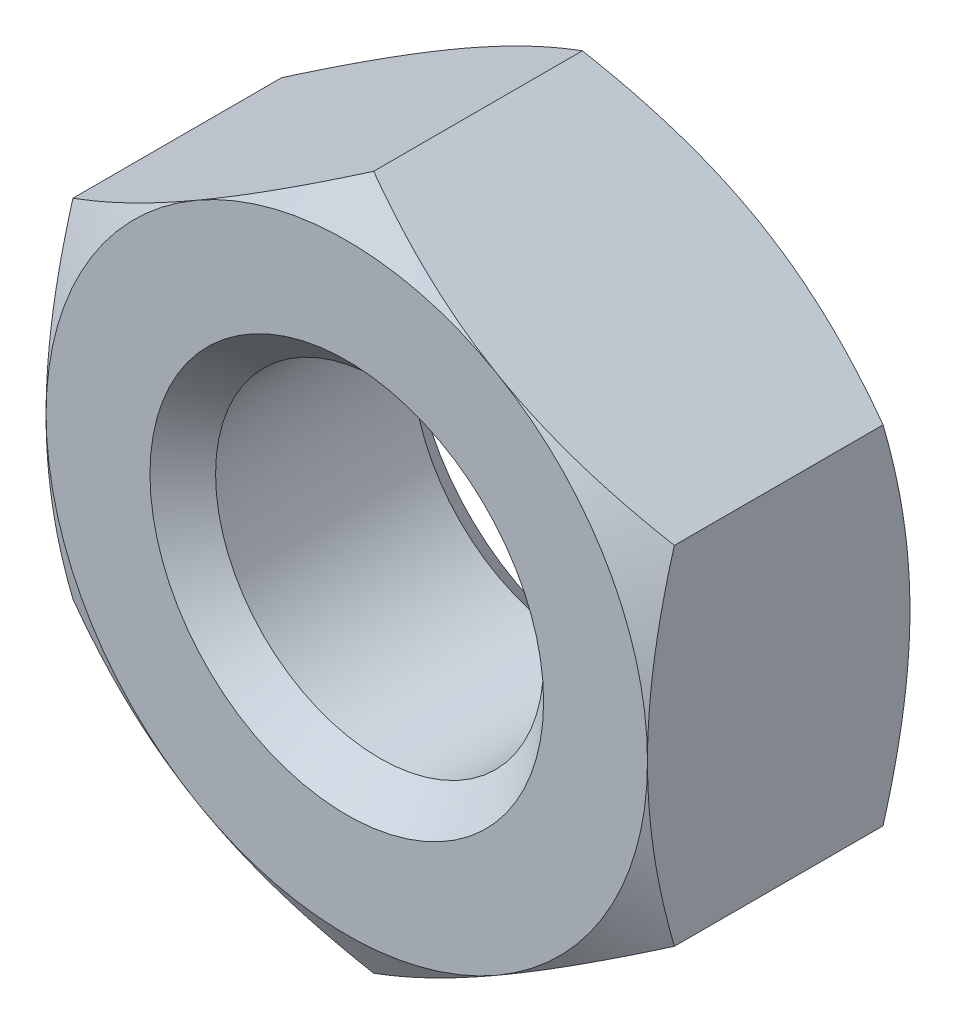
ISO-10303-21;
HEADER;
FILE_DESCRIPTION(('STEP AP214'),'2;1');
FILE_NAME('part.step','',(''),(''),'','','');
FILE_SCHEMA(('AUTOMOTIVE_DESIGN { 1 0 10303 214 1 1 1 1 }'));
ENDSEC;
DATA;
#1=APPLICATION_CONTEXT('core data for automotive mechanical design processes');
#2=APPLICATION_PROTOCOL_DEFINITION('international standard','automotive_design',2000,#1);
#3=PRODUCT_CONTEXT('',#1,'mechanical');
#4=PRODUCT('Part','Part','',(#3));
#5=PRODUCT_RELATED_PRODUCT_CATEGORY('part','',(#4));
#6=PRODUCT_DEFINITION_FORMATION('','',#4);
#7=PRODUCT_DEFINITION_CONTEXT('part definition',#1,'design');
#8=PRODUCT_DEFINITION('design','',#6,#7);
#9=PRODUCT_DEFINITION_SHAPE('','',#8);
#10=(LENGTH_UNIT() NAMED_UNIT(*) SI_UNIT(.MILLI.,.METRE.));
#11=(NAMED_UNIT(*) PLANE_ANGLE_UNIT() SI_UNIT($,.RADIAN.));
#12=(NAMED_UNIT(*) SI_UNIT($,.STERADIAN.) SOLID_ANGLE_UNIT());
#13=UNCERTAINTY_MEASURE_WITH_UNIT(LENGTH_MEASURE(1.E-05),#10,'distance_accuracy_value','');
#14=(GEOMETRIC_REPRESENTATION_CONTEXT(3) GLOBAL_UNCERTAINTY_ASSIGNED_CONTEXT((#13)) GLOBAL_UNIT_ASSIGNED_CONTEXT((#10,
#11,#12)) REPRESENTATION_CONTEXT('',''));
#15=CARTESIAN_POINT('',(0.,0.,0.));
#16=DIRECTION('',(0.,0.,1.));
#17=DIRECTION('',(1.,0.,0.));
#18=AXIS2_PLACEMENT_3D('',#15,#16,#17);
#19=CARTESIAN_POINT('',(0.,0.,2.4));
#20=DIRECTION('',(0.,0.,-1.));
#21=DIRECTION('',(-1.,0.,0.));
#22=AXIS2_PLACEMENT_3D('',#19,#20,#21);
#23=CONICAL_SURFACE('',#22,2.74999999999999,1.0471975511966);
#24=CARTESIAN_POINT('',(-0.000200000000000956,3.17554195059678,2.15431323663524));
#25=CARTESIAN_POINT('',(0.120649220659905,3.10576962051743,2.19461233775073));
#26=CARTESIAN_POINT('',(0.242541602622633,3.03539502097908,2.23126309740234));
#27=CARTESIAN_POINT('',(0.488437126727891,2.89342717394439,2.2952378170302));
#28=CARTESIAN_POINT('',(0.612444638573854,2.82183140359858,2.3225391443255));
#29=CARTESIAN_POINT('',(0.858922797975942,2.67952717191842,2.36503825470588));
#30=CARTESIAN_POINT('',(0.981355518587416,2.60884060771577,2.38051888137754));
#31=CARTESIAN_POINT('',(1.22679714236891,2.46713482015519,2.39900060263006));
#32=CARTESIAN_POINT('',(1.34980515323291,2.39611611197038,2.4020170005374));
#33=CARTESIAN_POINT('',(1.57965878661079,2.26341005486544,2.39574685457145));
#34=CARTESIAN_POINT('',(1.68653879125402,2.20170285541369,2.3879998457233));
#35=CARTESIAN_POINT('',(1.89960246733475,2.07869048467395,2.36344481893564));
#36=CARTESIAN_POINT('',(2.00578540164889,2.01738573896434,2.34662841034943));
#37=CARTESIAN_POINT('',(2.21928848939318,1.89411967378235,2.30458807765404));
#38=CARTESIAN_POINT('',(2.32658161614285,1.83217395817123,2.27918591931277));
#39=CARTESIAN_POINT('',(2.53956747928405,1.70920651275308,2.22153277416002));
#40=CARTESIAN_POINT('',(2.64526294502665,1.64818320715446,2.18929533670102));
#41=CARTESIAN_POINT('',(2.7502,1.58759777021764,2.15431323663524));
#42=B_SPLINE_CURVE_WITH_KNOTS('',3,(#24,#25,#26,#27,#28,#29,#30,#31,#32,#33,#34,#35,#36,#37,#38,
#39,#40,#41),.UNSPECIFIED.,.F.,.F.,(4,2,2,2,2,2,2,2,4),(0.,0.435912828725888,0.872873557116331,
1.29901931904671,1.72464171213573,2.09526089052937,2.46622354066374,2.84541551798557,
3.22386274754524),.UNSPECIFIED.);
#43=CARTESIAN_POINT('',(0.,3.17542648054294,2.15437990693814));
#44=VERTEX_POINT('',#43);
#45=CARTESIAN_POINT('',(1.375,2.38156986040721,2.4));
#46=VERTEX_POINT('',#45);
#47=EDGE_CURVE('E290',#44,#46,#42,.T.);
#48=ORIENTED_EDGE('',*,*,#47,.F.);
#49=CARTESIAN_POINT('',(-2.7502,1.58759777021763,2.15431323663524));
#50=CARTESIAN_POINT('',(-2.62935077934009,1.65737010029699,2.19461233775074));
#51=CARTESIAN_POINT('',(-2.50745839737737,1.72774469983533,2.23126309740234));
#52=CARTESIAN_POINT('',(-2.26156287327211,1.86971254687003,2.2952378170302));
#53=CARTESIAN_POINT('',(-2.13755536142614,1.94130831721583,2.3225391443255));
#54=CARTESIAN_POINT('',(-1.89107720202406,2.08361254889599,2.36503825470588));
#55=CARTESIAN_POINT('',(-1.76864448141258,2.15429911309864,2.38051888137754));
#56=CARTESIAN_POINT('',(-1.52320285763109,2.29600490065923,2.39900060263006));
#57=CARTESIAN_POINT('',(-1.40019484676709,2.36702360884404,2.4020170005374));
#58=CARTESIAN_POINT('',(-1.17034121338921,2.49972966594897,2.39574685457145));
#59=CARTESIAN_POINT('',(-1.06346120874598,2.56143686540073,2.3879998457233));
#60=CARTESIAN_POINT('',(-0.850397532665251,2.68444923614046,2.36344481893564));
#61=CARTESIAN_POINT('',(-0.744214598351111,2.74575398185008,2.34662841034943));
#62=CARTESIAN_POINT('',(-0.530711510606817,2.86902004703206,2.30458807765404));
#63=CARTESIAN_POINT('',(-0.423418383857146,2.93096576264318,2.27918591931277));
#64=CARTESIAN_POINT('',(-0.21043252071595,3.05393320806134,2.22153277416002));
#65=CARTESIAN_POINT('',(-0.104737054973348,3.11495651365995,2.18929533670102));
#66=CARTESIAN_POINT('',(0.000199999999998952,3.17554195059678,2.15431323663524));
#67=B_SPLINE_CURVE_WITH_KNOTS('',3,(#49,#50,#51,#52,#53,#54,#55,#56,#57,#58,#59,#60,#61,#62,#63,
#64,#65,#66),.UNSPECIFIED.,.F.,.F.,(4,2,2,2,2,2,2,2,4),(0.,0.435912828725888,0.872873557116331,
1.29901931904671,1.72464171213573,2.09526089052937,2.46622354066374,2.84541551798557,
3.22386274754524),.UNSPECIFIED.);
#68=CARTESIAN_POINT('',(-1.375,2.3815698604072,2.4));
#69=VERTEX_POINT('',#68);
#70=EDGE_CURVE('E185',#69,#44,#67,.T.);
#71=ORIENTED_EDGE('',*,*,#70,.F.);
#72=CARTESIAN_POINT('',(0.,0.,2.4));
#73=DIRECTION('',(0.,0.,1.));
#74=DIRECTION('',(1.,0.,0.));
#75=AXIS2_PLACEMENT_3D('',#72,#73,#74);
#76=CIRCLE('',#75,2.74999999999999);
#77=EDGE_CURVE('E293',#46,#69,#76,.T.);
#78=ORIENTED_EDGE('',*,*,#77,.F.);
#79=EDGE_LOOP('',(#48,#71,#78));
#80=FACE_BOUND('',#79,.T.);
#81=ADVANCED_FACE('F34',(#80),#23,.T.);
#82=CARTESIAN_POINT('',(2.75,1.58771324027147,2.15437990693814));
#83=VERTEX_POINT('',#82);
#84=EDGE_CURVE('E228',#46,#83,#42,.T.);
#85=ORIENTED_EDGE('',*,*,#84,.F.);
#86=CARTESIAN_POINT('',(2.75,0.,2.4));
#87=VERTEX_POINT('',#86);
#88=EDGE_CURVE('E150',#87,#46,#76,.T.);
#89=ORIENTED_EDGE('',*,*,#88,.F.);
#90=CARTESIAN_POINT('',(2.75,-4.2168242339339,1.08116278656109));
#91=CARTESIAN_POINT('',(2.75,-4.09603703531195,1.13955861611692));
#92=CARTESIAN_POINT('',(2.75,-3.97496493145791,1.19737577109415));
#93=CARTESIAN_POINT('',(2.75,-3.73209689574417,1.31152219563668));
#94=CARTESIAN_POINT('',(2.75,-3.61030084360811,1.36785120899004));
#95=CARTESIAN_POINT('',(2.75,-3.36517590540257,1.47898625620549));
#96=CARTESIAN_POINT('',(2.75,-3.24184223980786,1.5337817860504));
#97=CARTESIAN_POINT('',(2.75,-2.99416342051523,1.64102783845281));
#98=CARTESIAN_POINT('',(2.75,-2.86981831972063,1.69347848273961));
#99=CARTESIAN_POINT('',(2.75,-2.61834746028677,1.79604554979606));
#100=CARTESIAN_POINT('',(2.75,-2.49120637273191,1.84612459510075));
#101=CARTESIAN_POINT('',(2.75,-2.23542668575144,1.94237540457807));
#102=CARTESIAN_POINT('',(2.75,-2.10678792179923,1.98854673477406));
#103=CARTESIAN_POINT('',(2.75,-1.8480704466003,2.07574586666894));
#104=CARTESIAN_POINT('',(2.75,-1.71799544128962,2.11678455175498));
#105=CARTESIAN_POINT('',(2.75,-1.45599596679683,2.19238946193699));
#106=CARTESIAN_POINT('',(2.75,-1.32407209489248,2.22695772775981));
#107=CARTESIAN_POINT('',(2.75,-1.05828725071346,2.28794682395108));
#108=CARTESIAN_POINT('',(2.75,-0.924425845513397,2.31436580306384));
#109=CARTESIAN_POINT('',(2.75,-0.655082446819992,2.35728271685336));
#110=CARTESIAN_POINT('',(2.75,-0.519600452944037,2.37378064918776));
#111=CARTESIAN_POINT('',(2.75,-0.248587158257116,2.39539614360341));
#112=CARTESIAN_POINT('',(2.75,-0.11306180437275,2.400586376139));
#113=CARTESIAN_POINT('',(2.75,0.157903901119134,2.39930808557646));
#114=CARTESIAN_POINT('',(2.75,0.293344265697949,2.39284261980861));
#115=CARTESIAN_POINT('',(2.75,0.524440714708305,2.37232216214596));
#116=CARTESIAN_POINT('',(2.75,0.62035131964063,2.36098014392554));
#117=CARTESIAN_POINT('',(2.75,0.81143566214081,2.33318570677033));
#118=CARTESIAN_POINT('',(2.75,0.906609281825054,2.31673248690527));
#119=CARTESIAN_POINT('',(2.75,1.19094492996529,2.26056903357191));
#120=CARTESIAN_POINT('',(2.75,1.37877883239588,2.21406933314649));
#121=CARTESIAN_POINT('',(2.75,1.65985527821032,2.13381925193692));
#122=CARTESIAN_POINT('',(2.75,1.75456166739172,2.10490803332331));
#123=CARTESIAN_POINT('',(2.75,1.94298612436378,2.04421214901231));
#124=CARTESIAN_POINT('',(2.75,2.03670482331285,2.0124294604322));
#125=CARTESIAN_POINT('',(2.75,2.22276207977635,1.94665298493381));
#126=CARTESIAN_POINT('',(2.75,2.31510543361457,1.91267262805081));
#127=CARTESIAN_POINT('',(2.75,2.49907460103441,1.84270924628523));
#128=CARTESIAN_POINT('',(2.75,2.59070010932415,1.80672541703888));
#129=CARTESIAN_POINT('',(2.75,2.68199376510632,1.76993728554647));
#130=B_SPLINE_CURVE_WITH_KNOTS('',3,(#90,#91,#92,#93,#94,#95,#96,#97,#98,#99,#100,#101,#102,
#103,#104,#105,#106,#107,#108,#109,#110,#111,#112,#113,#114,#115,#116,#117,#118,#119,#120,#121,
#122,#123,#124,#125,#126,#127,#128,#129),.UNSPECIFIED.,.F.,.F.,(4,2,2,2,2,2,2,2,2,2,2,2,2,2,2,2,
2,2,2,4),(0.,0.402493360368358,0.805055571903377,1.20991106865585,1.61474552380934,
2.02464088525632,2.43458170862463,2.84363798989705,3.25256503936949,3.66158491561185,
4.07060488842396,4.47698838837614,4.88326530802959,5.17286074262768,5.46250158002234,
6.04221220969898,6.33925145814178,6.63608772005808,6.93125578235463,7.22654321688608),.UNSPECIFIED.);
#131=EDGE_CURVE('E226',#83,#87,#130,.F.);
#132=ORIENTED_EDGE('',*,*,#131,.F.);
#133=EDGE_LOOP('',(#85,#89,#132));
#134=FACE_BOUND('',#133,.T.);
#135=ADVANCED_FACE('F281',(#134),#23,.T.);
#136=CARTESIAN_POINT('',(2.75,-1.58771324027147,2.15437990693814));
#137=VERTEX_POINT('',#136);
#138=EDGE_CURVE('E221',#87,#137,#130,.F.);
#139=ORIENTED_EDGE('',*,*,#138,.F.);
#140=CARTESIAN_POINT('',(1.375,-2.38156986040721,2.4));
#141=VERTEX_POINT('',#140);
#142=EDGE_CURVE('E296',#141,#87,#76,.T.);
#143=ORIENTED_EDGE('',*,*,#142,.F.);
#144=CARTESIAN_POINT('',(2.7502,-1.58759777021763,2.15431323663524));
#145=CARTESIAN_POINT('',(2.62935077934009,-1.65737010029699,2.19461233775074));
#146=CARTESIAN_POINT('',(2.50745839737736,-1.72774469983533,2.23126309740234));
#147=CARTESIAN_POINT('',(2.26156287327211,-1.86971254687003,2.2952378170302));
#148=CARTESIAN_POINT('',(2.13755536142614,-1.94130831721583,2.3225391443255));
#149=CARTESIAN_POINT('',(1.89107720202405,-2.08361254889599,2.36503825470588));
#150=CARTESIAN_POINT('',(1.76864448141258,-2.15429911309864,2.38051888137754));
#151=CARTESIAN_POINT('',(1.52320285763108,-2.29600490065923,2.39900060263006));
#152=CARTESIAN_POINT('',(1.40019484676709,-2.36702360884404,2.4020170005374));
#153=CARTESIAN_POINT('',(1.17034121338921,-2.49972966594897,2.39574685457145));
#154=CARTESIAN_POINT('',(1.06346120874598,-2.56143686540072,2.3879998457233));
#155=CARTESIAN_POINT('',(0.85039753266525,-2.68444923614046,2.36344481893564));
#156=CARTESIAN_POINT('',(0.74421459835111,-2.74575398185008,2.34662841034943));
#157=CARTESIAN_POINT('',(0.530711510606816,-2.86902004703206,2.30458807765404));
#158=CARTESIAN_POINT('',(0.423418383857145,-2.93096576264318,2.27918591931277));
#159=CARTESIAN_POINT('',(0.210432520715949,-3.05393320806134,2.22153277416002));
#160=CARTESIAN_POINT('',(0.104737054973348,-3.11495651365995,2.18929533670102));
#161=CARTESIAN_POINT('',(-0.000199999999999843,-3.17554195059678,2.15431323663524));
#162=B_SPLINE_CURVE_WITH_KNOTS('',3,(#144,#145,#146,#147,#148,#149,#150,#151,#152,#153,#154,
#155,#156,#157,#158,#159,#160,#161),.UNSPECIFIED.,.F.,.F.,(4,2,2,2,2,2,2,2,4),(0.,
0.435912828725887,0.87287355711633,1.29901931904671,1.72464171213573,2.09526089052937,
2.46622354066374,2.84541551798557,3.22386274754524),.UNSPECIFIED.);
#163=EDGE_CURVE('E227',#137,#141,#162,.T.);
#164=ORIENTED_EDGE('',*,*,#163,.F.);
#165=EDGE_LOOP('',(#139,#143,#164));
#166=FACE_BOUND('',#165,.T.);
#167=ADVANCED_FACE('F286',(#166),#23,.T.);
#168=CARTESIAN_POINT('',(0.,-3.17542648054294,2.15437990693814));
#169=VERTEX_POINT('',#168);
#170=EDGE_CURVE('E215',#141,#169,#162,.T.);
#171=ORIENTED_EDGE('',*,*,#170,.F.);
#172=CARTESIAN_POINT('',(-1.375,-2.38156986040721,2.4));
#173=VERTEX_POINT('',#172);
#174=EDGE_CURVE('E298',#173,#141,#76,.T.);
#175=ORIENTED_EDGE('',*,*,#174,.F.);
#176=CARTESIAN_POINT('',(0.000199999999999783,-3.17554195059678,2.15431323663524));
#177=CARTESIAN_POINT('',(-0.120649220659906,-3.10576962051742,2.19461233775074));
#178=CARTESIAN_POINT('',(-0.242541602622634,-3.03539502097908,2.23126309740234));
#179=CARTESIAN_POINT('',(-0.488437126727892,-2.89342717394438,2.2952378170302));
#180=CARTESIAN_POINT('',(-0.612444638573855,-2.82183140359858,2.3225391443255));
#181=CARTESIAN_POINT('',(-0.858922797975943,-2.67952717191842,2.36503825470588));
#182=CARTESIAN_POINT('',(-0.981355518587416,-2.60884060771577,2.38051888137754));
#183=CARTESIAN_POINT('',(-1.22679714236891,-2.46713482015518,2.39900060263006));
#184=CARTESIAN_POINT('',(-1.34980515323291,-2.39611611197037,2.4020170005374));
#185=CARTESIAN_POINT('',(-1.57965878661079,-2.26341005486544,2.39574685457145));
#186=CARTESIAN_POINT('',(-1.68653879125402,-2.20170285541369,2.3879998457233));
#187=CARTESIAN_POINT('',(-1.89960246733475,-2.07869048467395,2.36344481893564));
#188=CARTESIAN_POINT('',(-2.00578540164889,-2.01738573896433,2.34662841034943));
#189=CARTESIAN_POINT('',(-2.21928848939318,-1.89411967378235,2.30458807765404));
#190=CARTESIAN_POINT('',(-2.32658161614285,-1.83217395817123,2.27918591931277));
#191=CARTESIAN_POINT('',(-2.53956747928405,-1.70920651275307,2.22153277416002));
#192=CARTESIAN_POINT('',(-2.64526294502665,-1.64818320715446,2.18929533670102));
#193=CARTESIAN_POINT('',(-2.7502,-1.58759777021763,2.15431323663524));
#194=B_SPLINE_CURVE_WITH_KNOTS('',3,(#176,#177,#178,#179,#180,#181,#182,#183,#184,#185,#186,
#187,#188,#189,#190,#191,#192,#193),.UNSPECIFIED.,.F.,.F.,(4,2,2,2,2,2,2,2,4),(0.,
0.435912828725888,0.872873557116331,1.29901931904671,1.72464171213573,2.09526089052937,
2.46622354066374,2.84541551798557,3.22386274754524),.UNSPECIFIED.);
#195=EDGE_CURVE('E322',#169,#173,#194,.T.);
#196=ORIENTED_EDGE('',*,*,#195,.F.);
#197=EDGE_LOOP('',(#171,#175,#196));
#198=FACE_BOUND('',#197,.T.);
#199=ADVANCED_FACE('F326',(#198),#23,.T.);
#200=CARTESIAN_POINT('',(-2.75,-1.58771324027147,2.15437990693814));
#201=VERTEX_POINT('',#200);
#202=EDGE_CURVE('E210',#173,#201,#194,.T.);
#203=ORIENTED_EDGE('',*,*,#202,.F.);
#204=CARTESIAN_POINT('',(-2.75,0.,2.4));
#205=VERTEX_POINT('',#204);
#206=EDGE_CURVE('E313',#205,#173,#76,.T.);
#207=ORIENTED_EDGE('',*,*,#206,.F.);
#208=CARTESIAN_POINT('',(-2.75,-4.2168242339339,1.08116278656109));
#209=CARTESIAN_POINT('',(-2.75,-4.09603703531196,1.13955861611692));
#210=CARTESIAN_POINT('',(-2.75,-3.97496493145791,1.19737577109415));
#211=CARTESIAN_POINT('',(-2.75,-3.73209689574417,1.31152219563668));
#212=CARTESIAN_POINT('',(-2.75,-3.61030084360811,1.36785120899004));
#213=CARTESIAN_POINT('',(-2.75,-3.36517590540258,1.47898625620549));
#214=CARTESIAN_POINT('',(-2.75,-3.24184223980786,1.5337817860504));
#215=CARTESIAN_POINT('',(-2.75,-2.99416342051523,1.6410278384528));
#216=CARTESIAN_POINT('',(-2.75,-2.86981831972063,1.69347848273961));
#217=CARTESIAN_POINT('',(-2.75,-2.61834746028677,1.79604554979606));
#218=CARTESIAN_POINT('',(-2.75,-2.49120637273191,1.84612459510074));
#219=CARTESIAN_POINT('',(-2.75,-2.23542668575144,1.94237540457807));
#220=CARTESIAN_POINT('',(-2.75,-2.10678792179922,1.98854673477406));
#221=CARTESIAN_POINT('',(-2.75,-1.8480704466003,2.07574586666894));
#222=CARTESIAN_POINT('',(-2.75,-1.71799544128962,2.11678455175498));
#223=CARTESIAN_POINT('',(-2.75,-1.45599596679683,2.19238946193699));
#224=CARTESIAN_POINT('',(-2.75,-1.32407209489248,2.2269577277598));
#225=CARTESIAN_POINT('',(-2.75,-1.05828725071346,2.28794682395108));
#226=CARTESIAN_POINT('',(-2.75,-0.924425845513396,2.31436580306384));
#227=CARTESIAN_POINT('',(-2.75,-0.655082446819991,2.35728271685336));
#228=CARTESIAN_POINT('',(-2.75,-0.519600452944036,2.37378064918776));
#229=CARTESIAN_POINT('',(-2.75,-0.248587158257115,2.39539614360341));
#230=CARTESIAN_POINT('',(-2.75,-0.113061804372749,2.400586376139));
#231=CARTESIAN_POINT('',(-2.75,0.157903901119135,2.39930808557646));
#232=CARTESIAN_POINT('',(-2.75,0.29334426569795,2.39284261980861));
#233=CARTESIAN_POINT('',(-2.75,0.524440714708306,2.37232216214595));
#234=CARTESIAN_POINT('',(-2.75,0.620351319640631,2.36098014392554));
#235=CARTESIAN_POINT('',(-2.75,0.81143566214081,2.33318570677033));
#236=CARTESIAN_POINT('',(-2.75,0.906609281825056,2.31673248690526));
#237=CARTESIAN_POINT('',(-2.75,1.19094492996529,2.26056903357191));
#238=CARTESIAN_POINT('',(-2.75,1.37877883239589,2.21406933314649));
#239=CARTESIAN_POINT('',(-2.75,1.65985527821033,2.13381925193691));
#240=CARTESIAN_POINT('',(-2.75,1.75456166739172,2.10490803332331));
#241=CARTESIAN_POINT('',(-2.75,1.94298612436379,2.04421214901231));
#242=CARTESIAN_POINT('',(-2.75,2.03670482331285,2.0124294604322));
#243=CARTESIAN_POINT('',(-2.75,2.22276207977636,1.94665298493381));
#244=CARTESIAN_POINT('',(-2.75,2.31510543361457,1.9126726280508));
#245=CARTESIAN_POINT('',(-2.75,2.49907460103441,1.84270924628522));
#246=CARTESIAN_POINT('',(-2.75,2.59070010932416,1.80672541703888));
#247=CARTESIAN_POINT('',(-2.75,2.68199376510633,1.76993728554647));
#248=B_SPLINE_CURVE_WITH_KNOTS('',3,(#208,#209,#210,#211,#212,#213,#214,#215,#216,#217,#218,
#219,#220,#221,#222,#223,#224,#225,#226,#227,#228,#229,#230,#231,#232,#233,#234,#235,#236,#237,
#238,#239,#240,#241,#242,#243,#244,#245,#246,#247),.UNSPECIFIED.,.F.,.F.,(4,2,2,2,2,2,2,2,2,2,2,
2,2,2,2,2,2,2,2,4),(0.,0.402493360368358,0.805055571903377,1.20991106865585,1.61474552380935,
2.02464088525632,2.43458170862463,2.84363798989705,3.2525650393695,3.66158491561185,
4.07060488842396,4.47698838837614,4.88326530802959,5.17286074262768,5.46250158002235,
6.04221220969899,6.33925145814179,6.63608772005809,6.93125578235464,7.22654321688608),.UNSPECIFIED.);
#249=EDGE_CURVE('E318',#201,#205,#248,.T.);
#250=ORIENTED_EDGE('',*,*,#249,.F.);
#251=EDGE_LOOP('',(#203,#207,#250));
#252=FACE_BOUND('',#251,.T.);
#253=ADVANCED_FACE('F202',(#252),#23,.T.);
#254=CARTESIAN_POINT('',(0.,0.,0.288675134594814));
#255=DIRECTION('',(0.,0.,1.));
#256=DIRECTION('',(1.,0.,0.));
#257=AXIS2_PLACEMENT_3D('',#254,#255,#256);
#258=CONICAL_SURFACE('',#257,3.25,1.0471975511966);
#259=CARTESIAN_POINT('',(-0.000200000000000217,-3.17554195059678,0.245686763364761));
#260=CARTESIAN_POINT('',(0.120649220659906,-3.10576962051742,0.205387662249264));
#261=CARTESIAN_POINT('',(0.242541602622634,-3.03539502097908,0.168736902597663));
#262=CARTESIAN_POINT('',(0.488437126727892,-2.89342717394438,0.104762182969802));
#263=CARTESIAN_POINT('',(0.612444638573855,-2.82183140359858,0.0774608556744986));
#264=CARTESIAN_POINT('',(0.858922797975943,-2.67952717191842,0.0349617452941183));
#265=CARTESIAN_POINT('',(0.981355518587416,-2.60884060771577,0.0194811186224594));
#266=CARTESIAN_POINT('',(1.22679714236891,-2.46713482015518,0.00099939736994213));
#267=CARTESIAN_POINT('',(1.34980515323291,-2.39611611197037,-0.00201700053739867));
#268=CARTESIAN_POINT('',(1.57965878661079,-2.26341005486544,0.00425314542854825));
#269=CARTESIAN_POINT('',(1.68653879125402,-2.20170285541369,0.0120001542767039));
#270=CARTESIAN_POINT('',(1.89960246733475,-2.07869048467395,0.0365551810643561));
#271=CARTESIAN_POINT('',(2.00578540164889,-2.01738573896433,0.0533715896505716));
#272=CARTESIAN_POINT('',(2.21928848939318,-1.89411967378235,0.0954119223459572));
#273=CARTESIAN_POINT('',(2.32658161614285,-1.83217395817123,0.120814080687231));
#274=CARTESIAN_POINT('',(2.53956747928405,-1.70920651275308,0.178467225839982));
#275=CARTESIAN_POINT('',(2.64526294502665,-1.64818320715446,0.210704663298982));
#276=CARTESIAN_POINT('',(2.7502,-1.58759777021763,0.24568676336476));
#277=B_SPLINE_CURVE_WITH_KNOTS('',3,(#259,#260,#261,#262,#263,#264,#265,#266,#267,#268,#269,
#270,#271,#272,#273,#274,#275,#276),.UNSPECIFIED.,.F.,.F.,(4,2,2,2,2,2,2,2,4),(0.,
0.435912828725888,0.872873557116331,1.29901931904671,1.72464171213573,2.09526089052937,
2.46622354066374,2.84541551798557,3.22386274754524),.UNSPECIFIED.);
#278=CARTESIAN_POINT('',(0.,-3.17542648054294,0.245620093061863));
#279=VERTEX_POINT('',#278);
#280=CARTESIAN_POINT('',(1.375,-2.38156986040721,0.));
#281=VERTEX_POINT('',#280);
#282=EDGE_CURVE('E258',#279,#281,#277,.T.);
#283=ORIENTED_EDGE('',*,*,#282,.F.);
#284=CARTESIAN_POINT('',(-2.7502,-1.58759777021763,0.245686763364761));
#285=CARTESIAN_POINT('',(-2.62935077934009,-1.65737010029699,0.205387662249264));
#286=CARTESIAN_POINT('',(-2.50745839737737,-1.72774469983533,0.168736902597663));
#287=CARTESIAN_POINT('',(-2.26156287327211,-1.86971254687003,0.104762182969802));
#288=CARTESIAN_POINT('',(-2.13755536142614,-1.94130831721583,0.0774608556744991));
#289=CARTESIAN_POINT('',(-1.89107720202406,-2.08361254889599,0.0349617452941187));
#290=CARTESIAN_POINT('',(-1.76864448141258,-2.15429911309864,0.0194811186224596));
#291=CARTESIAN_POINT('',(-1.52320285763108,-2.29600490065923,0.000999397369942366));
#292=CARTESIAN_POINT('',(-1.40019484676709,-2.36702360884404,-0.00201700053739826));
#293=CARTESIAN_POINT('',(-1.17034121338921,-2.49972966594897,0.00425314542854864));
#294=CARTESIAN_POINT('',(-1.06346120874598,-2.56143686540072,0.0120001542767042));
#295=CARTESIAN_POINT('',(-0.85039753266525,-2.68444923614046,0.0365551810643563));
#296=CARTESIAN_POINT('',(-0.744214598351111,-2.74575398185008,0.0533715896505717));
#297=CARTESIAN_POINT('',(-0.530711510606817,-2.86902004703206,0.0954119223459575));
#298=CARTESIAN_POINT('',(-0.423418383857145,-2.93096576264318,0.120814080687232));
#299=CARTESIAN_POINT('',(-0.210432520715949,-3.05393320806134,0.178467225839983));
#300=CARTESIAN_POINT('',(-0.104737054973348,-3.11495651365995,0.210704663298983));
#301=CARTESIAN_POINT('',(0.000199999999999287,-3.17554195059678,0.24568676336476));
#302=B_SPLINE_CURVE_WITH_KNOTS('',3,(#284,#285,#286,#287,#288,#289,#290,#291,#292,#293,#294,
#295,#296,#297,#298,#299,#300,#301),.UNSPECIFIED.,.F.,.F.,(4,2,2,2,2,2,2,2,4),(0.,
0.435912828725888,0.872873557116331,1.29901931904671,1.72464171213573,2.09526089052937,
2.46622354066374,2.84541551798557,3.22386274754524),.UNSPECIFIED.);
#303=CARTESIAN_POINT('',(-1.375,-2.38156986040721,0.));
#304=VERTEX_POINT('',#303);
#305=EDGE_CURVE('E259',#304,#279,#302,.T.);
#306=ORIENTED_EDGE('',*,*,#305,.F.);
#307=CARTESIAN_POINT('',(0.,0.,0.));
#308=DIRECTION('',(0.,0.,1.));
#309=DIRECTION('',(1.,0.,0.));
#310=AXIS2_PLACEMENT_3D('',#307,#308,#309);
#311=CIRCLE('',#310,2.74999999999999);
#312=EDGE_CURVE('E161',#281,#304,#311,.F.);
#313=ORIENTED_EDGE('',*,*,#312,.F.);
#314=EDGE_LOOP('',(#283,#306,#313));
#315=FACE_BOUND('',#314,.T.);
#316=ADVANCED_FACE('F357',(#315),#258,.T.);
#317=CARTESIAN_POINT('',(2.75,-1.58771324027147,0.245620093061862));
#318=VERTEX_POINT('',#317);
#319=EDGE_CURVE('E253',#281,#318,#277,.T.);
#320=ORIENTED_EDGE('',*,*,#319,.F.);
#321=CARTESIAN_POINT('',(2.75,0.,0.));
#322=VERTEX_POINT('',#321);
#323=EDGE_CURVE('E152',#322,#281,#311,.F.);
#324=ORIENTED_EDGE('',*,*,#323,.F.);
#325=CARTESIAN_POINT('',(2.75,-4.2168242339339,1.31883721343891));
#326=CARTESIAN_POINT('',(2.75,-4.09603703531195,1.26044138388308));
#327=CARTESIAN_POINT('',(2.75,-3.97496493145791,1.20262422890585));
#328=CARTESIAN_POINT('',(2.75,-3.73209689574417,1.08847780436332));
#329=CARTESIAN_POINT('',(2.75,-3.61030084360811,1.03214879100996));
#330=CARTESIAN_POINT('',(2.75,-3.36517590540257,0.921013743794508));
#331=CARTESIAN_POINT('',(2.75,-3.24184223980786,0.8662182139496));
#332=CARTESIAN_POINT('',(2.75,-2.99416342051523,0.758972161547195));
#333=CARTESIAN_POINT('',(2.75,-2.86981831972063,0.706521517260392));
#334=CARTESIAN_POINT('',(2.75,-2.61834746028677,0.60395445020394));
#335=CARTESIAN_POINT('',(2.75,-2.49120637273191,0.553875404899256));
#336=CARTESIAN_POINT('',(2.75,-2.23542668575144,0.45762459542193));
#337=CARTESIAN_POINT('',(2.75,-2.10678792179923,0.411453265225941));
#338=CARTESIAN_POINT('',(2.75,-1.8480704466003,0.324254133331062));
#339=CARTESIAN_POINT('',(2.75,-1.71799544128962,0.283215448245023));
#340=CARTESIAN_POINT('',(2.75,-1.45599596679683,0.207610538063014));
#341=CARTESIAN_POINT('',(2.75,-1.32407209489248,0.173042272240195));
#342=CARTESIAN_POINT('',(2.75,-1.05828725071346,0.11205317604892));
#343=CARTESIAN_POINT('',(2.75,-0.924425845513397,0.0856341969361633));
#344=CARTESIAN_POINT('',(2.75,-0.655082446819991,0.0427172831466394));
#345=CARTESIAN_POINT('',(2.75,-0.519600452944037,0.0262193508122365));
#346=CARTESIAN_POINT('',(2.75,-0.248587158257116,0.0046038563965916));
#347=CARTESIAN_POINT('',(2.75,-0.11306180437275,-0.000586376139000701));
#348=CARTESIAN_POINT('',(2.75,0.157903901119135,0.000691914423535405));
#349=CARTESIAN_POINT('',(2.75,0.293344265697949,0.00715738019138507));
#350=CARTESIAN_POINT('',(2.75,0.524440714708305,0.027677837854044));
#351=CARTESIAN_POINT('',(2.75,0.62035131964063,0.0390198560744575));
#352=CARTESIAN_POINT('',(2.75,0.811435662140809,0.0668142932296693));
#353=CARTESIAN_POINT('',(2.75,0.906609281825054,0.0832675130947343));
#354=CARTESIAN_POINT('',(2.75,1.19094492996529,0.139430966428091));
#355=CARTESIAN_POINT('',(2.75,1.37877883239588,0.185930666853508));
#356=CARTESIAN_POINT('',(2.75,1.65985527821032,0.266180748063083));
#357=CARTESIAN_POINT('',(2.75,1.75456166739171,0.295091966676684));
#358=CARTESIAN_POINT('',(2.75,1.94298612436378,0.35578785098769));
#359=CARTESIAN_POINT('',(2.75,2.03670482331285,0.387570539567797));
#360=CARTESIAN_POINT('',(2.75,2.22276207977635,0.453347015066185));
#361=CARTESIAN_POINT('',(2.75,2.31510543361457,0.487327371949193));
#362=CARTESIAN_POINT('',(2.75,2.49907460103441,0.557290753714772));
#363=CARTESIAN_POINT('',(2.75,2.59070010932415,0.593274582961117));
#364=CARTESIAN_POINT('',(2.75,2.68199376510632,0.630062714453528));
#365=B_SPLINE_CURVE_WITH_KNOTS('',3,(#325,#326,#327,#328,#329,#330,#331,#332,#333,#334,#335,
#336,#337,#338,#339,#340,#341,#342,#343,#344,#345,#346,#347,#348,#349,#350,#351,#352,#353,#354,
#355,#356,#357,#358,#359,#360,#361,#362,#363,#364),.UNSPECIFIED.,.F.,.F.,(4,2,2,2,2,2,2,2,2,2,2,
2,2,2,2,2,2,2,2,4),(0.,0.402493360368357,0.805055571903377,1.20991106865585,1.61474552380934,
2.02464088525632,2.43458170862463,2.84363798989705,3.25256503936949,3.66158491561185,
4.07060488842396,4.47698838837614,4.88326530802959,5.17286074262768,5.46250158002234,
6.04221220969898,6.33925145814178,6.63608772005808,6.93125578235463,7.22654321688607),.UNSPECIFIED.);
#366=EDGE_CURVE('E248',#318,#322,#365,.T.);
#367=ORIENTED_EDGE('',*,*,#366,.F.);
#368=EDGE_LOOP('',(#320,#324,#367));
#369=FACE_BOUND('',#368,.T.);
#370=ADVANCED_FACE('F352',(#369),#258,.T.);
#371=CARTESIAN_POINT('',(2.75,1.58771324027147,0.245620093061863));
#372=VERTEX_POINT('',#371);
#373=EDGE_CURVE('E146',#322,#372,#365,.T.);
#374=ORIENTED_EDGE('',*,*,#373,.F.);
#375=CARTESIAN_POINT('',(1.375,2.38156986040721,0.));
#376=VERTEX_POINT('',#375);
#377=EDGE_CURVE('E144',#376,#322,#311,.F.);
#378=ORIENTED_EDGE('',*,*,#377,.F.);
#379=CARTESIAN_POINT('',(2.7502,1.58759777021764,0.245686763364761));
#380=CARTESIAN_POINT('',(2.62935077934009,1.65737010029699,0.205387662249264));
#381=CARTESIAN_POINT('',(2.50745839737736,1.72774469983533,0.168736902597663));
#382=CARTESIAN_POINT('',(2.2615628732721,1.86971254687003,0.104762182969802));
#383=CARTESIAN_POINT('',(2.13755536142614,1.94130831721583,0.0774608556744991));
#384=CARTESIAN_POINT('',(1.89107720202405,2.08361254889599,0.0349617452941189));
#385=CARTESIAN_POINT('',(1.76864448141258,2.15429911309864,0.0194811186224601));
#386=CARTESIAN_POINT('',(1.52320285763108,2.29600490065923,0.000999397369943013));
#387=CARTESIAN_POINT('',(1.40019484676708,2.36702360884404,-0.00201700053739769));
#388=CARTESIAN_POINT('',(1.1703412133892,2.49972966594897,0.00425314542854945));
#389=CARTESIAN_POINT('',(1.06346120874598,2.56143686540073,0.0120001542767052));
#390=CARTESIAN_POINT('',(0.850397532665248,2.68444923614047,0.0365551810643576));
#391=CARTESIAN_POINT('',(0.744214598351109,2.74575398185008,0.053371589650573));
#392=CARTESIAN_POINT('',(0.530711510606815,2.86902004703206,0.0954119223459587));
#393=CARTESIAN_POINT('',(0.423418383857144,2.93096576264318,0.120814080687233));
#394=CARTESIAN_POINT('',(0.210432520715948,3.05393320806134,0.178467225839983));
#395=CARTESIAN_POINT('',(0.104737054973347,3.11495651365995,0.210704663298984));
#396=CARTESIAN_POINT('',(-0.00020000000000052,3.17554195059678,0.245686763364762));
#397=B_SPLINE_CURVE_WITH_KNOTS('',3,(#379,#380,#381,#382,#383,#384,#385,#386,#387,#388,#389,
#390,#391,#392,#393,#394,#395,#396),.UNSPECIFIED.,.F.,.F.,(4,2,2,2,2,2,2,2,4),(0.,
0.435912828725888,0.872873557116332,1.29901931904671,1.72464171213573,2.09526089052937,
2.46622354066374,2.84541551798557,3.22386274754524),.UNSPECIFIED.);
#398=EDGE_CURVE('E124',#372,#376,#397,.T.);
#399=ORIENTED_EDGE('',*,*,#398,.F.);
#400=EDGE_LOOP('',(#374,#378,#399));
#401=FACE_BOUND('',#400,.T.);
#402=ADVANCED_FACE('F145',(#401),#258,.T.);
#403=CARTESIAN_POINT('',(-2.75,-1.58771324027147,0.245620093061863));
#404=VERTEX_POINT('',#403);
#405=EDGE_CURVE('E249',#404,#304,#302,.T.);
#406=ORIENTED_EDGE('',*,*,#405,.F.);
#407=CARTESIAN_POINT('',(-2.75,-4.2168242339339,1.31883721343891));
#408=CARTESIAN_POINT('',(-2.75,-4.09603703531196,1.26044138388308));
#409=CARTESIAN_POINT('',(-2.75,-3.97496493145791,1.20262422890585));
#410=CARTESIAN_POINT('',(-2.75,-3.73209689574417,1.08847780436332));
#411=CARTESIAN_POINT('',(-2.75,-3.61030084360811,1.03214879100996));
#412=CARTESIAN_POINT('',(-2.75,-3.36517590540258,0.921013743794509));
#413=CARTESIAN_POINT('',(-2.75,-3.24184223980786,0.8662182139496));
#414=CARTESIAN_POINT('',(-2.75,-2.99416342051523,0.758972161547195));
#415=CARTESIAN_POINT('',(-2.75,-2.86981831972063,0.706521517260393));
#416=CARTESIAN_POINT('',(-2.75,-2.61834746028677,0.60395445020394));
#417=CARTESIAN_POINT('',(-2.75,-2.49120637273191,0.553875404899256));
#418=CARTESIAN_POINT('',(-2.75,-2.23542668575144,0.45762459542193));
#419=CARTESIAN_POINT('',(-2.75,-2.10678792179922,0.411453265225941));
#420=CARTESIAN_POINT('',(-2.75,-1.8480704466003,0.324254133331063));
#421=CARTESIAN_POINT('',(-2.75,-1.71799544128962,0.283215448245023));
#422=CARTESIAN_POINT('',(-2.75,-1.45599596679683,0.207610538063015));
#423=CARTESIAN_POINT('',(-2.75,-1.32407209489248,0.173042272240195));
#424=CARTESIAN_POINT('',(-2.75,-1.05828725071346,0.112053176048921));
#425=CARTESIAN_POINT('',(-2.75,-0.924425845513396,0.0856341969361643));
#426=CARTESIAN_POINT('',(-2.75,-0.655082446819991,0.0427172831466405));
#427=CARTESIAN_POINT('',(-2.75,-0.519600452944036,0.0262193508122377));
#428=CARTESIAN_POINT('',(-2.75,-0.248587158257115,0.00460385639659286));
#429=CARTESIAN_POINT('',(-2.75,-0.113061804372749,-0.000586376138999491));
#430=CARTESIAN_POINT('',(-2.75,0.157903901119136,0.000691914423536683));
#431=CARTESIAN_POINT('',(-2.75,0.29334426569795,0.00715738019138649));
#432=CARTESIAN_POINT('',(-2.75,0.524440714708307,0.0276778378540457));
#433=CARTESIAN_POINT('',(-2.75,0.620351319640632,0.0390198560744593));
#434=CARTESIAN_POINT('',(-2.75,0.811435662140811,0.0668142932296712));
#435=CARTESIAN_POINT('',(-2.75,0.906609281825056,0.0832675130947362));
#436=CARTESIAN_POINT('',(-2.75,1.19094492996529,0.139430966428093));
#437=CARTESIAN_POINT('',(-2.75,1.37877883239589,0.18593066685351));
#438=CARTESIAN_POINT('',(-2.75,1.65985527821033,0.266180748063085));
#439=CARTESIAN_POINT('',(-2.75,1.75456166739172,0.295091966676687));
#440=CARTESIAN_POINT('',(-2.75,1.94298612436378,0.355787850987693));
#441=CARTESIAN_POINT('',(-2.75,2.03670482331285,0.3875705395678));
#442=CARTESIAN_POINT('',(-2.75,2.22276207977635,0.453347015066188));
#443=CARTESIAN_POINT('',(-2.75,2.31510543361457,0.487327371949196));
#444=CARTESIAN_POINT('',(-2.75,2.49907460103441,0.557290753714775));
#445=CARTESIAN_POINT('',(-2.75,2.59070010932415,0.59327458296112));
#446=CARTESIAN_POINT('',(-2.75,2.68199376510633,0.630062714453531));
#447=B_SPLINE_CURVE_WITH_KNOTS('',3,(#407,#408,#409,#410,#411,#412,#413,#414,#415,#416,#417,
#418,#419,#420,#421,#422,#423,#424,#425,#426,#427,#428,#429,#430,#431,#432,#433,#434,#435,#436,
#437,#438,#439,#440,#441,#442,#443,#444,#445,#446),.UNSPECIFIED.,.F.,.F.,(4,2,2,2,2,2,2,2,2,2,2,
2,2,2,2,2,2,2,2,4),(0.,0.402493360368358,0.805055571903378,1.20991106865585,1.61474552380935,
2.02464088525632,2.43458170862463,2.84363798989705,3.2525650393695,3.66158491561185,
4.07060488842396,4.47698838837614,4.8832653080296,5.17286074262768,5.46250158002235,
6.04221220969899,6.33925145814179,6.63608772005809,6.93125578235464,7.22654321688608),.UNSPECIFIED.);
#448=CARTESIAN_POINT('',(-2.75,0.,0.));
#449=VERTEX_POINT('',#448);
#450=EDGE_CURVE('E134',#449,#404,#447,.F.);
#451=ORIENTED_EDGE('',*,*,#450,.F.);
#452=EDGE_CURVE('E157',#304,#449,#311,.F.);
#453=ORIENTED_EDGE('',*,*,#452,.F.);
#454=EDGE_LOOP('',(#406,#451,#453));
#455=FACE_BOUND('',#454,.T.);
#456=ADVANCED_FACE('F359',(#455),#258,.T.);
#457=CARTESIAN_POINT('',(0.,3.17542648054294,0.245620093061863));
#458=VERTEX_POINT('',#457);
#459=EDGE_CURVE('E128',#376,#458,#397,.T.);
#460=ORIENTED_EDGE('',*,*,#459,.F.);
#461=CARTESIAN_POINT('',(-1.375,2.3815698604072,0.));
#462=VERTEX_POINT('',#461);
#463=EDGE_CURVE('E140',#462,#376,#311,.F.);
#464=ORIENTED_EDGE('',*,*,#463,.F.);
#465=CARTESIAN_POINT('',(0.000199999999999133,3.17554195059678,0.245686763364761));
#466=CARTESIAN_POINT('',(-0.120649220659907,3.10576962051743,0.205387662249264));
#467=CARTESIAN_POINT('',(-0.242541602622635,3.03539502097908,0.168736902597664));
#468=CARTESIAN_POINT('',(-0.488437126727894,2.89342717394438,0.104762182969803));
#469=CARTESIAN_POINT('',(-0.612444638573856,2.82183140359858,0.0774608556744995));
#470=CARTESIAN_POINT('',(-0.858922797975944,2.67952717191842,0.0349617452941191));
#471=CARTESIAN_POINT('',(-0.981355518587418,2.60884060771577,0.0194811186224601));
#472=CARTESIAN_POINT('',(-1.22679714236892,2.46713482015518,0.000999397369942879));
#473=CARTESIAN_POINT('',(-1.34980515323291,2.39611611197037,-0.00201700053739777));
#474=CARTESIAN_POINT('',(-1.57965878661079,2.26341005486544,0.0042531454285492));
#475=CARTESIAN_POINT('',(-1.68653879125402,2.20170285541369,0.0120001542767048));
#476=CARTESIAN_POINT('',(-1.89960246733475,2.07869048467395,0.0365551810643571));
#477=CARTESIAN_POINT('',(-2.00578540164889,2.01738573896433,0.0533715896505726));
#478=CARTESIAN_POINT('',(-2.21928848939318,1.89411967378235,0.0954119223459585));
#479=CARTESIAN_POINT('',(-2.32658161614285,1.83217395817123,0.120814080687233));
#480=CARTESIAN_POINT('',(-2.53956747928405,1.70920651275308,0.178467225839983));
#481=CARTESIAN_POINT('',(-2.64526294502665,1.64818320715446,0.210704663298984));
#482=CARTESIAN_POINT('',(-2.7502,1.58759777021763,0.245686763364761));
#483=B_SPLINE_CURVE_WITH_KNOTS('',3,(#465,#466,#467,#468,#469,#470,#471,#472,#473,#474,#475,
#476,#477,#478,#479,#480,#481,#482),.UNSPECIFIED.,.F.,.F.,(4,2,2,2,2,2,2,2,4),(0.,
0.435912828725888,0.872873557116331,1.29901931904671,1.72464171213573,2.09526089052937,
2.46622354066374,2.84541551798557,3.22386274754524),.UNSPECIFIED.);
#484=EDGE_CURVE('E56',#458,#462,#483,.T.);
#485=ORIENTED_EDGE('',*,*,#484,.F.);
#486=EDGE_LOOP('',(#460,#464,#485));
#487=FACE_BOUND('',#486,.T.);
#488=ADVANCED_FACE('F138',(#487),#258,.T.);
#489=CARTESIAN_POINT('',(0.,0.,2.4));
#490=DIRECTION('',(0.,0.,-1.));
#491=DIRECTION('',(-1.,0.,0.));
#492=AXIS2_PLACEMENT_3D('',#489,#490,#491);
#493=CYLINDRICAL_SURFACE('',#492,1.5);
#494=CARTESIAN_POINT('',(0.,0.,0.3));
#495=DIRECTION('',(0.,0.,1.));
#496=DIRECTION('',(1.,0.,0.));
#497=AXIS2_PLACEMENT_3D('',#494,#495,#496);
#498=CIRCLE('',#497,1.5);
#499=CARTESIAN_POINT('',(1.5,0.,0.3));
#500=VERTEX_POINT('',#499);
#501=EDGE_CURVE('E42',#500,#500,#498,.F.);
#502=ORIENTED_EDGE('',*,*,#501,.T.);
#503=EDGE_LOOP('',(#502));
#504=FACE_BOUND('',#503,.T.);
#505=CARTESIAN_POINT('',(0.,0.,2.1));
#506=DIRECTION('',(0.,0.,1.));
#507=DIRECTION('',(1.,0.,0.));
#508=AXIS2_PLACEMENT_3D('',#505,#506,#507);
#509=CIRCLE('',#508,1.5);
#510=CARTESIAN_POINT('',(1.5,0.,2.1));
#511=VERTEX_POINT('',#510);
#512=EDGE_CURVE('E263',#511,#511,#509,.T.);
#513=ORIENTED_EDGE('',*,*,#512,.T.);
#514=EDGE_LOOP('',(#513));
#515=FACE_BOUND('',#514,.T.);
#516=ADVANCED_FACE('F203',(#504,#515),#493,.F.);
#517=CARTESIAN_POINT('',(0.,0.,2.4));
#518=DIRECTION('',(0.,0.,1.));
#519=DIRECTION('',(1.,0.,0.));
#520=AXIS2_PLACEMENT_3D('',#517,#518,#519);
#521=PLANE('',#520);
#522=CARTESIAN_POINT('',(0.,0.,2.4));
#523=DIRECTION('',(0.,0.,1.));
#524=DIRECTION('',(1.,0.,0.));
#525=AXIS2_PLACEMENT_3D('',#522,#523,#524);
#526=CIRCLE('',#525,1.8);
#527=CARTESIAN_POINT('',(1.8,0.,2.4));
#528=VERTEX_POINT('',#527);
#529=EDGE_CURVE('E11',#528,#528,#526,.F.);
#530=ORIENTED_EDGE('',*,*,#529,.T.);
#531=EDGE_LOOP('',(#530));
#532=FACE_BOUND('',#531,.T.);
#533=ORIENTED_EDGE('',*,*,#88,.T.);
#534=ORIENTED_EDGE('',*,*,#77,.T.);
#535=EDGE_CURVE('E311',#69,#205,#76,.T.);
#536=ORIENTED_EDGE('',*,*,#535,.T.);
#537=ORIENTED_EDGE('',*,*,#206,.T.);
#538=ORIENTED_EDGE('',*,*,#174,.T.);
#539=ORIENTED_EDGE('',*,*,#142,.T.);
#540=EDGE_LOOP('',(#533,#534,#536,#537,#538,#539));
#541=FACE_BOUND('',#540,.T.);
#542=ADVANCED_FACE('F275',(#532,#541),#521,.T.);
#543=CARTESIAN_POINT('',(0.,0.,0.));
#544=DIRECTION('',(0.,0.,1.));
#545=DIRECTION('',(1.,0.,0.));
#546=AXIS2_PLACEMENT_3D('',#543,#544,#545);
#547=PLANE('',#546);
#548=CARTESIAN_POINT('',(0.,0.,0.));
#549=DIRECTION('',(0.,0.,1.));
#550=DIRECTION('',(1.,0.,0.));
#551=AXIS2_PLACEMENT_3D('',#548,#549,#550);
#552=CIRCLE('',#551,1.8);
#553=CARTESIAN_POINT('',(1.8,0.,0.));
#554=VERTEX_POINT('',#553);
#555=EDGE_CURVE('E260',#554,#554,#552,.T.);
#556=ORIENTED_EDGE('',*,*,#555,.T.);
#557=EDGE_LOOP('',(#556));
#558=FACE_BOUND('',#557,.T.);
#559=ORIENTED_EDGE('',*,*,#323,.T.);
#560=ORIENTED_EDGE('',*,*,#312,.T.);
#561=ORIENTED_EDGE('',*,*,#452,.T.);
#562=EDGE_CURVE('E156',#449,#462,#311,.F.);
#563=ORIENTED_EDGE('',*,*,#562,.T.);
#564=ORIENTED_EDGE('',*,*,#463,.T.);
#565=ORIENTED_EDGE('',*,*,#377,.T.);
#566=EDGE_LOOP('',(#559,#560,#561,#563,#564,#565));
#567=FACE_BOUND('',#566,.T.);
#568=ADVANCED_FACE('F153',(#558,#567),#547,.F.);
#569=CARTESIAN_POINT('',(-2.75,1.58771324027147,2.15437990693814));
#570=VERTEX_POINT('',#569);
#571=EDGE_CURVE('E192',#205,#570,#248,.T.);
#572=ORIENTED_EDGE('',*,*,#571,.F.);
#573=ORIENTED_EDGE('',*,*,#535,.F.);
#574=EDGE_CURVE('E49',#570,#69,#67,.T.);
#575=ORIENTED_EDGE('',*,*,#574,.F.);
#576=EDGE_LOOP('',(#572,#573,#575));
#577=FACE_BOUND('',#576,.T.);
#578=ADVANCED_FACE('F197',(#577),#23,.T.);
#579=CARTESIAN_POINT('',(-2.75,1.58771324027147,0.245620093061864));
#580=VERTEX_POINT('',#579);
#581=EDGE_CURVE('E142',#580,#449,#447,.F.);
#582=ORIENTED_EDGE('',*,*,#581,.F.);
#583=EDGE_CURVE('E160',#462,#580,#483,.T.);
#584=ORIENTED_EDGE('',*,*,#583,.F.);
#585=ORIENTED_EDGE('',*,*,#562,.F.);
#586=EDGE_LOOP('',(#582,#584,#585));
#587=FACE_BOUND('',#586,.T.);
#588=ADVANCED_FACE('F173',(#587),#258,.T.);
#589=CARTESIAN_POINT('',(1.375,2.38156986040721,2.4));
#590=DIRECTION('',(-0.5,-0.866025403784439,0.));
#591=DIRECTION('',(0.866025403784439,-0.5,0.));
#592=AXIS2_PLACEMENT_3D('',#589,#590,#591);
#593=PLANE('',#592);
#594=ORIENTED_EDGE('',*,*,#47,.T.);
#595=ORIENTED_EDGE('',*,*,#84,.T.);
#596=DIRECTION('',(0.,0.,-1.));
#597=VECTOR('',#596,1.);
#598=CARTESIAN_POINT('',(2.75,1.58771324027147,2.4));
#599=LINE('',#598,#597);
#600=EDGE_CURVE('E130',#83,#372,#599,.T.);
#601=ORIENTED_EDGE('',*,*,#600,.T.);
#602=ORIENTED_EDGE('',*,*,#398,.T.);
#603=ORIENTED_EDGE('',*,*,#459,.T.);
#604=DIRECTION('',(0.,0.,-1.));
#605=VECTOR('',#604,1.);
#606=CARTESIAN_POINT('',(0.,3.17542648054294,2.4));
#607=LINE('',#606,#605);
#608=EDGE_CURVE('E342',#44,#458,#607,.T.);
#609=ORIENTED_EDGE('',*,*,#608,.F.);
#610=EDGE_LOOP('',(#594,#595,#601,#602,#603,#609));
#611=FACE_BOUND('',#610,.T.);
#612=ADVANCED_FACE('F126',(#611),#593,.F.);
#613=CARTESIAN_POINT('',(2.75,0.,2.4));
#614=DIRECTION('',(-1.,0.,0.));
#615=DIRECTION('',(0.,-1.,0.));
#616=AXIS2_PLACEMENT_3D('',#613,#614,#615);
#617=PLANE('',#616);
#618=ORIENTED_EDGE('',*,*,#131,.T.);
#619=ORIENTED_EDGE('',*,*,#138,.T.);
#620=DIRECTION('',(0.,0.,-1.));
#621=VECTOR('',#620,1.);
#622=CARTESIAN_POINT('',(2.75,-1.58771324027147,2.4));
#623=LINE('',#622,#621);
#624=EDGE_CURVE('E334',#137,#318,#623,.T.);
#625=ORIENTED_EDGE('',*,*,#624,.T.);
#626=ORIENTED_EDGE('',*,*,#366,.T.);
#627=ORIENTED_EDGE('',*,*,#373,.T.);
#628=ORIENTED_EDGE('',*,*,#600,.F.);
#629=EDGE_LOOP('',(#618,#619,#625,#626,#627,#628));
#630=FACE_BOUND('',#629,.T.);
#631=ADVANCED_FACE('F233',(#630),#617,.F.);
#632=CARTESIAN_POINT('',(1.375,-2.3815698604072,2.4));
#633=DIRECTION('',(-0.5,0.866025403784439,0.));
#634=DIRECTION('',(-0.866025403784439,-0.5,0.));
#635=AXIS2_PLACEMENT_3D('',#632,#633,#634);
#636=PLANE('',#635);
#637=ORIENTED_EDGE('',*,*,#163,.T.);
#638=ORIENTED_EDGE('',*,*,#170,.T.);
#639=DIRECTION('',(0.,0.,-1.));
#640=VECTOR('',#639,1.);
#641=CARTESIAN_POINT('',(0.,-3.17542648054294,2.4));
#642=LINE('',#641,#640);
#643=EDGE_CURVE('E331',#169,#279,#642,.T.);
#644=ORIENTED_EDGE('',*,*,#643,.T.);
#645=ORIENTED_EDGE('',*,*,#282,.T.);
#646=ORIENTED_EDGE('',*,*,#319,.T.);
#647=ORIENTED_EDGE('',*,*,#624,.F.);
#648=EDGE_LOOP('',(#637,#638,#644,#645,#646,#647));
#649=FACE_BOUND('',#648,.T.);
#650=ADVANCED_FACE('F236',(#649),#636,.F.);
#651=CARTESIAN_POINT('',(-1.375,-2.38156986040721,2.4));
#652=DIRECTION('',(0.5,0.866025403784439,0.));
#653=DIRECTION('',(-0.866025403784439,0.5,0.));
#654=AXIS2_PLACEMENT_3D('',#651,#652,#653);
#655=PLANE('',#654);
#656=ORIENTED_EDGE('',*,*,#195,.T.);
#657=ORIENTED_EDGE('',*,*,#202,.T.);
#658=DIRECTION('',(0.,0.,-1.));
#659=VECTOR('',#658,1.);
#660=CARTESIAN_POINT('',(-2.75,-1.58771324027147,2.4));
#661=LINE('',#660,#659);
#662=EDGE_CURVE('E335',#201,#404,#661,.T.);
#663=ORIENTED_EDGE('',*,*,#662,.T.);
#664=ORIENTED_EDGE('',*,*,#405,.T.);
#665=ORIENTED_EDGE('',*,*,#305,.T.);
#666=ORIENTED_EDGE('',*,*,#643,.F.);
#667=EDGE_LOOP('',(#656,#657,#663,#664,#665,#666));
#668=FACE_BOUND('',#667,.T.);
#669=ADVANCED_FACE('F330',(#668),#655,.F.);
#670=CARTESIAN_POINT('',(-2.75,0.,2.4));
#671=DIRECTION('',(1.,0.,0.));
#672=DIRECTION('',(0.,1.,0.));
#673=AXIS2_PLACEMENT_3D('',#670,#671,#672);
#674=PLANE('',#673);
#675=ORIENTED_EDGE('',*,*,#249,.T.);
#676=ORIENTED_EDGE('',*,*,#571,.T.);
#677=DIRECTION('',(0.,0.,-1.));
#678=VECTOR('',#677,1.);
#679=CARTESIAN_POINT('',(-2.75,1.58771324027147,2.4));
#680=LINE('',#679,#678);
#681=EDGE_CURVE('E337',#570,#580,#680,.T.);
#682=ORIENTED_EDGE('',*,*,#681,.T.);
#683=ORIENTED_EDGE('',*,*,#581,.T.);
#684=ORIENTED_EDGE('',*,*,#450,.T.);
#685=ORIENTED_EDGE('',*,*,#662,.F.);
#686=EDGE_LOOP('',(#675,#676,#682,#683,#684,#685));
#687=FACE_BOUND('',#686,.T.);
#688=ADVANCED_FACE('F180',(#687),#674,.F.);
#689=CARTESIAN_POINT('',(-1.375,2.38156986040721,2.4));
#690=DIRECTION('',(0.5,-0.866025403784439,0.));
#691=DIRECTION('',(0.866025403784439,0.5,0.));
#692=AXIS2_PLACEMENT_3D('',#689,#690,#691);
#693=PLANE('',#692);
#694=ORIENTED_EDGE('',*,*,#574,.T.);
#695=ORIENTED_EDGE('',*,*,#70,.T.);
#696=ORIENTED_EDGE('',*,*,#608,.T.);
#697=ORIENTED_EDGE('',*,*,#484,.T.);
#698=ORIENTED_EDGE('',*,*,#583,.T.);
#699=ORIENTED_EDGE('',*,*,#681,.F.);
#700=EDGE_LOOP('',(#694,#695,#696,#697,#698,#699));
#701=FACE_BOUND('',#700,.T.);
#702=ADVANCED_FACE('F176',(#701),#693,.F.);
#703=CARTESIAN_POINT('',(0.,0.,0.));
#704=DIRECTION('',(0.,0.,-1.));
#705=DIRECTION('',(-1.,0.,0.));
#706=AXIS2_PLACEMENT_3D('',#703,#704,#705);
#707=CONICAL_SURFACE('',#706,1.8,0.785398163397447);
#708=ORIENTED_EDGE('',*,*,#501,.F.);
#709=EDGE_LOOP('',(#708));
#710=FACE_BOUND('',#709,.T.);
#711=ORIENTED_EDGE('',*,*,#555,.F.);
#712=EDGE_LOOP('',(#711));
#713=FACE_BOUND('',#712,.T.);
#714=ADVANCED_FACE('F179',(#710,#713),#707,.F.);
#715=CARTESIAN_POINT('',(0.,0.,2.1));
#716=DIRECTION('',(0.,0.,1.));
#717=DIRECTION('',(1.,0.,0.));
#718=AXIS2_PLACEMENT_3D('',#715,#716,#717);
#719=CONICAL_SURFACE('',#718,1.5,0.78539816339745);
#720=ORIENTED_EDGE('',*,*,#529,.F.);
#721=EDGE_LOOP('',(#720));
#722=FACE_BOUND('',#721,.T.);
#723=ORIENTED_EDGE('',*,*,#512,.F.);
#724=EDGE_LOOP('',(#723));
#725=FACE_BOUND('',#724,.T.);
#726=ADVANCED_FACE('F36',(#722,#725),#719,.F.);
#727=CLOSED_SHELL('',(#81,#135,#167,#199,#253,#316,#370,#402,#456,#488,#516,#542,#568,#578,#588,
#612,#631,#650,#669,#688,#702,#714,#726));
#728=MANIFOLD_SOLID_BREP('B2',#727);
#729=ADVANCED_BREP_SHAPE_REPRESENTATION('',(#18,#728),#14);
#730=SHAPE_DEFINITION_REPRESENTATION(#9,#729);
ENDSEC;
END-ISO-10303-21;
